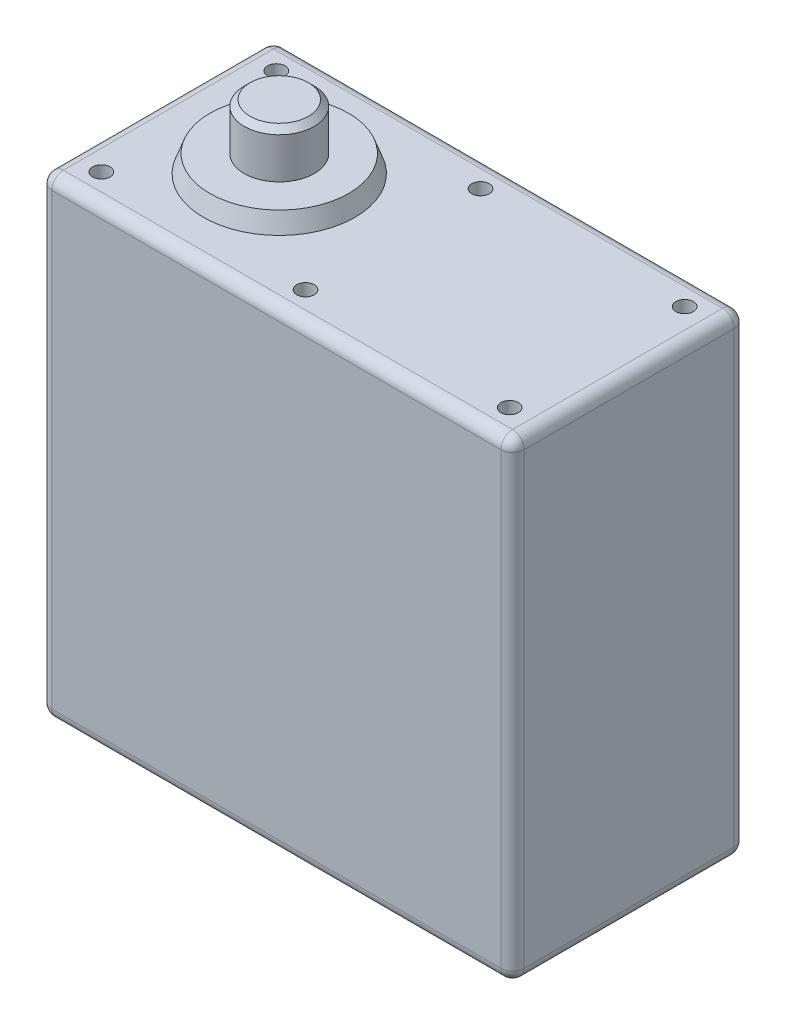
ISO-10303-21;
HEADER;
FILE_DESCRIPTION(('STEP AP214'),'2;1');
FILE_NAME('part.step','',(''),(''),'','','');
FILE_SCHEMA(('AUTOMOTIVE_DESIGN { 1 0 10303 214 1 1 1 1 }'));
ENDSEC;
DATA;
#1=APPLICATION_CONTEXT('core data for automotive mechanical design processes');
#2=APPLICATION_PROTOCOL_DEFINITION('international standard','automotive_design',2000,#1);
#3=PRODUCT_CONTEXT('',#1,'mechanical');
#4=PRODUCT('Part','Part','',(#3));
#5=PRODUCT_RELATED_PRODUCT_CATEGORY('part','',(#4));
#6=PRODUCT_DEFINITION_FORMATION('','',#4);
#7=PRODUCT_DEFINITION_CONTEXT('part definition',#1,'design');
#8=PRODUCT_DEFINITION('design','',#6,#7);
#9=PRODUCT_DEFINITION_SHAPE('','',#8);
#10=(LENGTH_UNIT() NAMED_UNIT(*) SI_UNIT(.MILLI.,.METRE.));
#11=(NAMED_UNIT(*) PLANE_ANGLE_UNIT() SI_UNIT($,.RADIAN.));
#12=(NAMED_UNIT(*) SI_UNIT($,.STERADIAN.) SOLID_ANGLE_UNIT());
#13=UNCERTAINTY_MEASURE_WITH_UNIT(LENGTH_MEASURE(1.E-05),#10,'distance_accuracy_value','');
#14=(GEOMETRIC_REPRESENTATION_CONTEXT(3) GLOBAL_UNCERTAINTY_ASSIGNED_CONTEXT((#13)) GLOBAL_UNIT_ASSIGNED_CONTEXT((#10,
#11,#12)) REPRESENTATION_CONTEXT('',''));
#15=CARTESIAN_POINT('',(0.,0.,0.));
#16=DIRECTION('',(0.,0.,1.));
#17=DIRECTION('',(1.,0.,0.));
#18=AXIS2_PLACEMENT_3D('',#15,#16,#17);
#19=CARTESIAN_POINT('',(-20.25,-20.25,20.));
#20=DIRECTION('',(0.,1.,0.));
#21=DIRECTION('',(0.,0.,1.));
#22=AXIS2_PLACEMENT_3D('',#19,#20,#21);
#23=PLANE('',#22);
#24=DIRECTION('',(0.,0.,-1.));
#25=VECTOR('',#24,1.);
#26=CARTESIAN_POINT('',(19.25,-20.25,20.));
#27=LINE('',#26,#25);
#28=CARTESIAN_POINT('',(19.25,-20.25,1.));
#29=VERTEX_POINT('',#28);
#30=CARTESIAN_POINT('',(19.25,-20.25,19.));
#31=VERTEX_POINT('',#30);
#32=EDGE_CURVE('E305',#29,#31,#27,.F.);
#33=ORIENTED_EDGE('',*,*,#32,.T.);
#34=DIRECTION('',(1.,0.,0.));
#35=VECTOR('',#34,1.);
#36=CARTESIAN_POINT('',(-19.25,-20.25,19.));
#37=LINE('',#36,#35);
#38=CARTESIAN_POINT('',(-19.25,-20.25,19.));
#39=VERTEX_POINT('',#38);
#40=EDGE_CURVE('E311',#31,#39,#37,.F.);
#41=ORIENTED_EDGE('',*,*,#40,.T.);
#42=DIRECTION('',(0.,0.,-1.));
#43=VECTOR('',#42,1.);
#44=CARTESIAN_POINT('',(-19.25,-20.25,20.));
#45=LINE('',#44,#43);
#46=CARTESIAN_POINT('',(-19.25,-20.25,1.));
#47=VERTEX_POINT('',#46);
#48=EDGE_CURVE('E309',#39,#47,#45,.T.);
#49=ORIENTED_EDGE('',*,*,#48,.T.);
#50=DIRECTION('',(1.,0.,0.));
#51=VECTOR('',#50,1.);
#52=CARTESIAN_POINT('',(-20.25,-20.25,1.));
#53=LINE('',#52,#51);
#54=EDGE_CURVE('E307',#47,#29,#53,.T.);
#55=ORIENTED_EDGE('',*,*,#54,.T.);
#56=EDGE_LOOP('',(#33,#41,#49,#55));
#57=FACE_BOUND('',#56,.T.);
#58=CARTESIAN_POINT('',(-17.5,-20.25,17.5));
#59=DIRECTION('',(0.,1.,0.));
#60=DIRECTION('',(0.,0.,-1.));
#61=AXIS2_PLACEMENT_3D('',#58,#59,#60);
#62=CIRCLE('',#61,0.750000000000002);
#63=CARTESIAN_POINT('',(-17.5,-20.25,16.75));
#64=VERTEX_POINT('',#63);
#65=EDGE_CURVE('E234',#64,#64,#62,.T.);
#66=ORIENTED_EDGE('',*,*,#65,.T.);
#67=EDGE_LOOP('',(#66));
#68=FACE_BOUND('',#67,.T.);
#69=CARTESIAN_POINT('',(0.,-20.25,17.5));
#70=DIRECTION('',(0.,1.,0.));
#71=DIRECTION('',(0.,0.,-1.));
#72=AXIS2_PLACEMENT_3D('',#69,#70,#71);
#73=CIRCLE('',#72,0.749999999999999);
#74=CARTESIAN_POINT('',(0.,-20.25,16.75));
#75=VERTEX_POINT('',#74);
#76=EDGE_CURVE('E240',#75,#75,#73,.T.);
#77=ORIENTED_EDGE('',*,*,#76,.T.);
#78=EDGE_LOOP('',(#77));
#79=FACE_BOUND('',#78,.T.);
#80=CARTESIAN_POINT('',(17.5,-20.25,17.5));
#81=DIRECTION('',(0.,1.,0.));
#82=DIRECTION('',(0.,0.,-1.));
#83=AXIS2_PLACEMENT_3D('',#80,#81,#82);
#84=CIRCLE('',#83,0.750000000000002);
#85=CARTESIAN_POINT('',(17.5,-20.25,16.75));
#86=VERTEX_POINT('',#85);
#87=EDGE_CURVE('E246',#86,#86,#84,.T.);
#88=ORIENTED_EDGE('',*,*,#87,.T.);
#89=EDGE_LOOP('',(#88));
#90=FACE_BOUND('',#89,.T.);
#91=CARTESIAN_POINT('',(17.5,-20.25,2.5));
#92=DIRECTION('',(0.,1.,0.));
#93=DIRECTION('',(0.,0.,1.));
#94=AXIS2_PLACEMENT_3D('',#91,#92,#93);
#95=CIRCLE('',#94,0.750000000000002);
#96=CARTESIAN_POINT('',(17.5,-20.25,3.25));
#97=VERTEX_POINT('',#96);
#98=EDGE_CURVE('E252',#97,#97,#95,.T.);
#99=ORIENTED_EDGE('',*,*,#98,.T.);
#100=EDGE_LOOP('',(#99));
#101=FACE_BOUND('',#100,.T.);
#102=CARTESIAN_POINT('',(0.,-20.25,2.5));
#103=DIRECTION('',(0.,1.,0.));
#104=DIRECTION('',(0.,0.,1.));
#105=AXIS2_PLACEMENT_3D('',#102,#103,#104);
#106=CIRCLE('',#105,0.75);
#107=CARTESIAN_POINT('',(0.,-20.25,3.25));
#108=VERTEX_POINT('',#107);
#109=EDGE_CURVE('E258',#108,#108,#106,.T.);
#110=ORIENTED_EDGE('',*,*,#109,.T.);
#111=EDGE_LOOP('',(#110));
#112=FACE_BOUND('',#111,.T.);
#113=CARTESIAN_POINT('',(-17.5,-20.25,2.50000000000001));
#114=DIRECTION('',(0.,1.,0.));
#115=DIRECTION('',(0.,0.,1.));
#116=AXIS2_PLACEMENT_3D('',#113,#114,#115);
#117=CIRCLE('',#116,0.750000000000002);
#118=CARTESIAN_POINT('',(-17.5,-20.25,3.25000000000001));
#119=VERTEX_POINT('',#118);
#120=EDGE_CURVE('E264',#119,#119,#117,.T.);
#121=ORIENTED_EDGE('',*,*,#120,.T.);
#122=EDGE_LOOP('',(#121));
#123=FACE_BOUND('',#122,.T.);
#124=CARTESIAN_POINT('',(-9.75,-20.25,10.));
#125=DIRECTION('',(0.,1.,0.));
#126=DIRECTION('',(0.,0.,1.));
#127=AXIS2_PLACEMENT_3D('',#124,#125,#126);
#128=CIRCLE('',#127,3.);
#129=CARTESIAN_POINT('',(-9.75,-20.25,13.));
#130=VERTEX_POINT('',#129);
#131=EDGE_CURVE('E281',#130,#130,#128,.F.);
#132=ORIENTED_EDGE('',*,*,#131,.F.);
#133=EDGE_LOOP('',(#132));
#134=FACE_BOUND('',#133,.T.);
#135=ADVANCED_FACE('F38',(#57,#68,#79,#90,#101,#112,#123,#134),#23,.F.);
#136=CARTESIAN_POINT('',(-9.75,21.75,10.));
#137=DIRECTION('',(0.,1.,0.));
#138=DIRECTION('',(0.,0.,1.));
#139=AXIS2_PLACEMENT_3D('',#136,#137,#138);
#140=PLANE('',#139);
#141=CARTESIAN_POINT('',(-9.75,21.75,10.));
#142=DIRECTION('',(0.,1.,0.));
#143=DIRECTION('',(0.,0.,1.));
#144=AXIS2_PLACEMENT_3D('',#141,#142,#143);
#145=CIRCLE('',#144,5.95404464860072);
#146=CARTESIAN_POINT('',(-9.75,21.75,15.9540446486007));
#147=VERTEX_POINT('',#146);
#148=EDGE_CURVE('E272',#147,#147,#145,.T.);
#149=ORIENTED_EDGE('',*,*,#148,.T.);
#150=EDGE_LOOP('',(#149));
#151=FACE_BOUND('',#150,.T.);
#152=CARTESIAN_POINT('',(-9.75,21.75,10.));
#153=DIRECTION('',(0.,1.,0.));
#154=DIRECTION('',(0.,0.,1.));
#155=AXIS2_PLACEMENT_3D('',#152,#153,#154);
#156=CIRCLE('',#155,3.);
#157=CARTESIAN_POINT('',(-9.75,21.75,13.));
#158=VERTEX_POINT('',#157);
#159=EDGE_CURVE('E230',#158,#158,#156,.T.);
#160=ORIENTED_EDGE('',*,*,#159,.F.);
#161=EDGE_LOOP('',(#160));
#162=FACE_BOUND('',#161,.T.);
#163=ADVANCED_FACE('F382',(#151,#162),#140,.T.);
#164=CARTESIAN_POINT('',(-20.25,20.25,20.));
#165=DIRECTION('',(0.,-1.,0.));
#166=DIRECTION('',(0.,0.,-1.));
#167=AXIS2_PLACEMENT_3D('',#164,#165,#166);
#168=PLANE('',#167);
#169=DIRECTION('',(0.,0.,-1.));
#170=VECTOR('',#169,1.);
#171=CARTESIAN_POINT('',(-19.25,20.25,20.));
#172=LINE('',#171,#170);
#173=CARTESIAN_POINT('',(-19.25,20.25,1.));
#174=VERTEX_POINT('',#173);
#175=CARTESIAN_POINT('',(-19.25,20.25,19.));
#176=VERTEX_POINT('',#175);
#177=EDGE_CURVE('E47',#174,#176,#172,.F.);
#178=ORIENTED_EDGE('',*,*,#177,.T.);
#179=DIRECTION('',(-1.,0.,0.));
#180=VECTOR('',#179,1.);
#181=CARTESIAN_POINT('',(19.25,20.25,19.));
#182=LINE('',#181,#180);
#183=CARTESIAN_POINT('',(19.25,20.25,19.));
#184=VERTEX_POINT('',#183);
#185=EDGE_CURVE('E11',#176,#184,#182,.F.);
#186=ORIENTED_EDGE('',*,*,#185,.T.);
#187=DIRECTION('',(0.,0.,-1.));
#188=VECTOR('',#187,1.);
#189=CARTESIAN_POINT('',(19.25,20.25,20.));
#190=LINE('',#189,#188);
#191=CARTESIAN_POINT('',(19.25,20.25,1.));
#192=VERTEX_POINT('',#191);
#193=EDGE_CURVE('E163',#184,#192,#190,.T.);
#194=ORIENTED_EDGE('',*,*,#193,.T.);
#195=DIRECTION('',(-1.,0.,0.));
#196=VECTOR('',#195,1.);
#197=CARTESIAN_POINT('',(-20.25,20.25,1.));
#198=LINE('',#197,#196);
#199=EDGE_CURVE('E58',#192,#174,#198,.T.);
#200=ORIENTED_EDGE('',*,*,#199,.T.);
#201=EDGE_LOOP('',(#178,#186,#194,#200));
#202=FACE_BOUND('',#201,.T.);
#203=CARTESIAN_POINT('',(-17.5,20.25,17.5));
#204=DIRECTION('',(0.,1.,0.));
#205=DIRECTION('',(0.,0.,-1.));
#206=AXIS2_PLACEMENT_3D('',#203,#204,#205);
#207=CIRCLE('',#206,0.750000000000002);
#208=CARTESIAN_POINT('',(-17.5,20.25,16.75));
#209=VERTEX_POINT('',#208);
#210=EDGE_CURVE('E233',#209,#209,#207,.T.);
#211=ORIENTED_EDGE('',*,*,#210,.F.);
#212=EDGE_LOOP('',(#211));
#213=FACE_BOUND('',#212,.T.);
#214=CARTESIAN_POINT('',(0.,20.25,17.5));
#215=DIRECTION('',(0.,1.,0.));
#216=DIRECTION('',(0.,0.,-1.));
#217=AXIS2_PLACEMENT_3D('',#214,#215,#216);
#218=CIRCLE('',#217,0.749999999999999);
#219=CARTESIAN_POINT('',(0.,20.25,16.75));
#220=VERTEX_POINT('',#219);
#221=EDGE_CURVE('E237',#220,#220,#218,.T.);
#222=ORIENTED_EDGE('',*,*,#221,.F.);
#223=EDGE_LOOP('',(#222));
#224=FACE_BOUND('',#223,.T.);
#225=CARTESIAN_POINT('',(17.5,20.25,17.5));
#226=DIRECTION('',(0.,1.,0.));
#227=DIRECTION('',(0.,0.,-1.));
#228=AXIS2_PLACEMENT_3D('',#225,#226,#227);
#229=CIRCLE('',#228,0.750000000000002);
#230=CARTESIAN_POINT('',(17.5,20.25,16.75));
#231=VERTEX_POINT('',#230);
#232=EDGE_CURVE('E243',#231,#231,#229,.T.);
#233=ORIENTED_EDGE('',*,*,#232,.F.);
#234=EDGE_LOOP('',(#233));
#235=FACE_BOUND('',#234,.T.);
#236=CARTESIAN_POINT('',(17.5,20.25,2.5));
#237=DIRECTION('',(0.,1.,0.));
#238=DIRECTION('',(0.,0.,1.));
#239=AXIS2_PLACEMENT_3D('',#236,#237,#238);
#240=CIRCLE('',#239,0.750000000000002);
#241=CARTESIAN_POINT('',(17.5,20.25,3.25));
#242=VERTEX_POINT('',#241);
#243=EDGE_CURVE('E249',#242,#242,#240,.T.);
#244=ORIENTED_EDGE('',*,*,#243,.F.);
#245=EDGE_LOOP('',(#244));
#246=FACE_BOUND('',#245,.T.);
#247=CARTESIAN_POINT('',(0.,20.25,2.5));
#248=DIRECTION('',(0.,1.,0.));
#249=DIRECTION('',(0.,0.,1.));
#250=AXIS2_PLACEMENT_3D('',#247,#248,#249);
#251=CIRCLE('',#250,0.75);
#252=CARTESIAN_POINT('',(0.,20.25,3.25));
#253=VERTEX_POINT('',#252);
#254=EDGE_CURVE('E255',#253,#253,#251,.T.);
#255=ORIENTED_EDGE('',*,*,#254,.F.);
#256=EDGE_LOOP('',(#255));
#257=FACE_BOUND('',#256,.T.);
#258=CARTESIAN_POINT('',(-17.5,20.25,2.50000000000001));
#259=DIRECTION('',(0.,1.,0.));
#260=DIRECTION('',(0.,0.,1.));
#261=AXIS2_PLACEMENT_3D('',#258,#259,#260);
#262=CIRCLE('',#261,0.750000000000002);
#263=CARTESIAN_POINT('',(-17.5,20.25,3.25000000000001));
#264=VERTEX_POINT('',#263);
#265=EDGE_CURVE('E261',#264,#264,#262,.T.);
#266=ORIENTED_EDGE('',*,*,#265,.F.);
#267=EDGE_LOOP('',(#266));
#268=FACE_BOUND('',#267,.T.);
#269=CARTESIAN_POINT('',(-9.75,20.25,10.));
#270=DIRECTION('',(0.,-1.,0.));
#271=DIRECTION('',(0.,0.,-1.));
#272=AXIS2_PLACEMENT_3D('',#269,#270,#271);
#273=CIRCLE('',#272,6.5);
#274=CARTESIAN_POINT('',(-9.75,20.25,3.5));
#275=VERTEX_POINT('',#274);
#276=EDGE_CURVE('E267',#275,#275,#273,.F.);
#277=ORIENTED_EDGE('',*,*,#276,.F.);
#278=EDGE_LOOP('',(#277));
#279=FACE_BOUND('',#278,.T.);
#280=ADVANCED_FACE('F335',(#202,#213,#224,#235,#246,#257,#268,#279),#168,.F.);
#281=CARTESIAN_POINT('',(-20.25,20.25,20.));
#282=DIRECTION('',(1.,0.,0.));
#283=DIRECTION('',(0.,1.,0.));
#284=AXIS2_PLACEMENT_3D('',#281,#282,#283);
#285=PLANE('',#284);
#286=DIRECTION('',(0.,-1.,0.));
#287=VECTOR('',#286,1.);
#288=CARTESIAN_POINT('',(-20.25,20.25,1.));
#289=LINE('',#288,#287);
#290=CARTESIAN_POINT('',(-20.25,19.25,1.));
#291=VERTEX_POINT('',#290);
#292=CARTESIAN_POINT('',(-20.25,-19.25,1.));
#293=VERTEX_POINT('',#292);
#294=EDGE_CURVE('E159',#291,#293,#289,.T.);
#295=ORIENTED_EDGE('',*,*,#294,.T.);
#296=DIRECTION('',(0.,0.,-1.));
#297=VECTOR('',#296,1.);
#298=CARTESIAN_POINT('',(-20.25,-19.25,20.));
#299=LINE('',#298,#297);
#300=CARTESIAN_POINT('',(-20.25,-19.25,19.));
#301=VERTEX_POINT('',#300);
#302=EDGE_CURVE('E320',#293,#301,#299,.F.);
#303=ORIENTED_EDGE('',*,*,#302,.T.);
#304=DIRECTION('',(0.,-1.,0.));
#305=VECTOR('',#304,1.);
#306=CARTESIAN_POINT('',(-20.25,20.25,19.));
#307=LINE('',#306,#305);
#308=CARTESIAN_POINT('',(-20.25,19.25,19.));
#309=VERTEX_POINT('',#308);
#310=EDGE_CURVE('E295',#301,#309,#307,.F.);
#311=ORIENTED_EDGE('',*,*,#310,.T.);
#312=DIRECTION('',(0.,0.,-1.));
#313=VECTOR('',#312,1.);
#314=CARTESIAN_POINT('',(-20.25,19.25,20.));
#315=LINE('',#314,#313);
#316=EDGE_CURVE('E318',#309,#291,#315,.T.);
#317=ORIENTED_EDGE('',*,*,#316,.T.);
#318=EDGE_LOOP('',(#295,#303,#311,#317));
#319=FACE_BOUND('',#318,.T.);
#320=ADVANCED_FACE('F454',(#319),#285,.F.);
#321=CARTESIAN_POINT('',(20.25,20.25,20.));
#322=DIRECTION('',(-1.,0.,0.));
#323=DIRECTION('',(0.,-1.,0.));
#324=AXIS2_PLACEMENT_3D('',#321,#322,#323);
#325=PLANE('',#324);
#326=DIRECTION('',(0.,1.,0.));
#327=VECTOR('',#326,1.);
#328=CARTESIAN_POINT('',(20.25,-20.25,19.));
#329=LINE('',#328,#327);
#330=CARTESIAN_POINT('',(20.25,19.25,19.));
#331=VERTEX_POINT('',#330);
#332=CARTESIAN_POINT('',(20.25,-19.25,19.));
#333=VERTEX_POINT('',#332);
#334=EDGE_CURVE('E131',#331,#333,#329,.F.);
#335=ORIENTED_EDGE('',*,*,#334,.T.);
#336=DIRECTION('',(0.,0.,-1.));
#337=VECTOR('',#336,1.);
#338=CARTESIAN_POINT('',(20.25,-19.25,20.));
#339=LINE('',#338,#337);
#340=CARTESIAN_POINT('',(20.25,-19.25,1.));
#341=VERTEX_POINT('',#340);
#342=EDGE_CURVE('E138',#333,#341,#339,.T.);
#343=ORIENTED_EDGE('',*,*,#342,.T.);
#344=DIRECTION('',(0.,1.,0.));
#345=VECTOR('',#344,1.);
#346=CARTESIAN_POINT('',(20.25,20.25,1.));
#347=LINE('',#346,#345);
#348=CARTESIAN_POINT('',(20.25,19.25,1.));
#349=VERTEX_POINT('',#348);
#350=EDGE_CURVE('E133',#341,#349,#347,.T.);
#351=ORIENTED_EDGE('',*,*,#350,.T.);
#352=DIRECTION('',(0.,0.,-1.));
#353=VECTOR('',#352,1.);
#354=CARTESIAN_POINT('',(20.25,19.25,20.));
#355=LINE('',#354,#353);
#356=EDGE_CURVE('E128',#349,#331,#355,.F.);
#357=ORIENTED_EDGE('',*,*,#356,.T.);
#358=EDGE_LOOP('',(#335,#343,#351,#357));
#359=FACE_BOUND('',#358,.T.);
#360=ADVANCED_FACE('F130',(#359),#325,.F.);
#361=CARTESIAN_POINT('',(-20.25,-20.25,20.));
#362=DIRECTION('',(0.,0.,1.));
#363=DIRECTION('',(1.,0.,0.));
#364=AXIS2_PLACEMENT_3D('',#361,#362,#363);
#365=PLANE('',#364);
#366=DIRECTION('',(0.,-1.,0.));
#367=VECTOR('',#366,1.);
#368=CARTESIAN_POINT('',(-19.25,-20.25,20.));
#369=LINE('',#368,#367);
#370=CARTESIAN_POINT('',(-19.25,19.25,20.));
#371=VERTEX_POINT('',#370);
#372=CARTESIAN_POINT('',(-19.25,-19.25,20.));
#373=VERTEX_POINT('',#372);
#374=EDGE_CURVE('E284',#371,#373,#369,.T.);
#375=ORIENTED_EDGE('',*,*,#374,.T.);
#376=DIRECTION('',(1.,0.,0.));
#377=VECTOR('',#376,1.);
#378=CARTESIAN_POINT('',(19.25,-19.25,20.));
#379=LINE('',#378,#377);
#380=CARTESIAN_POINT('',(19.25,-19.25,20.));
#381=VERTEX_POINT('',#380);
#382=EDGE_CURVE('E303',#373,#381,#379,.T.);
#383=ORIENTED_EDGE('',*,*,#382,.T.);
#384=DIRECTION('',(0.,1.,0.));
#385=VECTOR('',#384,1.);
#386=CARTESIAN_POINT('',(19.25,20.25,20.));
#387=LINE('',#386,#385);
#388=CARTESIAN_POINT('',(19.25,19.25,20.));
#389=VERTEX_POINT('',#388);
#390=EDGE_CURVE('E287',#381,#389,#387,.T.);
#391=ORIENTED_EDGE('',*,*,#390,.T.);
#392=DIRECTION('',(-1.,0.,0.));
#393=VECTOR('',#392,1.);
#394=CARTESIAN_POINT('',(-19.25,19.25,20.));
#395=LINE('',#394,#393);
#396=EDGE_CURVE('E301',#389,#371,#395,.T.);
#397=ORIENTED_EDGE('',*,*,#396,.T.);
#398=EDGE_LOOP('',(#375,#383,#391,#397));
#399=FACE_BOUND('',#398,.T.);
#400=ADVANCED_FACE('F447',(#399),#365,.T.);
#401=CARTESIAN_POINT('',(-20.25,-20.25,0.));
#402=DIRECTION('',(0.,0.,1.));
#403=DIRECTION('',(1.,0.,0.));
#404=AXIS2_PLACEMENT_3D('',#401,#402,#403);
#405=PLANE('',#404);
#406=DIRECTION('',(0.,1.,0.));
#407=VECTOR('',#406,1.);
#408=CARTESIAN_POINT('',(19.25,-20.25,0.));
#409=LINE('',#408,#407);
#410=CARTESIAN_POINT('',(19.25,19.25,0.));
#411=VERTEX_POINT('',#410);
#412=CARTESIAN_POINT('',(19.25,-19.25,0.));
#413=VERTEX_POINT('',#412);
#414=EDGE_CURVE('E292',#411,#413,#409,.F.);
#415=ORIENTED_EDGE('',*,*,#414,.T.);
#416=DIRECTION('',(1.,0.,0.));
#417=VECTOR('',#416,1.);
#418=CARTESIAN_POINT('',(-20.25,-19.25,0.));
#419=LINE('',#418,#417);
#420=CARTESIAN_POINT('',(-19.25,-19.25,0.));
#421=VERTEX_POINT('',#420);
#422=EDGE_CURVE('E328',#413,#421,#419,.F.);
#423=ORIENTED_EDGE('',*,*,#422,.T.);
#424=DIRECTION('',(0.,-1.,0.));
#425=VECTOR('',#424,1.);
#426=CARTESIAN_POINT('',(-19.25,-20.25,0.));
#427=LINE('',#426,#425);
#428=CARTESIAN_POINT('',(-19.25,19.25,0.));
#429=VERTEX_POINT('',#428);
#430=EDGE_CURVE('E151',#421,#429,#427,.F.);
#431=ORIENTED_EDGE('',*,*,#430,.T.);
#432=DIRECTION('',(-1.,0.,0.));
#433=VECTOR('',#432,1.);
#434=CARTESIAN_POINT('',(-20.25,19.25,0.));
#435=LINE('',#434,#433);
#436=EDGE_CURVE('E326',#429,#411,#435,.F.);
#437=ORIENTED_EDGE('',*,*,#436,.T.);
#438=EDGE_LOOP('',(#415,#423,#431,#437));
#439=FACE_BOUND('',#438,.T.);
#440=ADVANCED_FACE('F348',(#439),#405,.F.);
#441=CARTESIAN_POINT('',(-17.5,-20.25,2.50000000000001));
#442=DIRECTION('',(0.,1.,0.));
#443=DIRECTION('',(0.,0.,1.));
#444=AXIS2_PLACEMENT_3D('',#441,#442,#443);
#445=CYLINDRICAL_SURFACE('',#444,0.750000000000002);
#446=ORIENTED_EDGE('',*,*,#120,.F.);
#447=EDGE_LOOP('',(#446));
#448=FACE_BOUND('',#447,.T.);
#449=ORIENTED_EDGE('',*,*,#265,.T.);
#450=EDGE_LOOP('',(#449));
#451=FACE_BOUND('',#450,.T.);
#452=ADVANCED_FACE('F442',(#448,#451),#445,.F.);
#453=CARTESIAN_POINT('',(0.,-20.25,2.5));
#454=DIRECTION('',(0.,1.,0.));
#455=DIRECTION('',(0.,0.,1.));
#456=AXIS2_PLACEMENT_3D('',#453,#454,#455);
#457=CYLINDRICAL_SURFACE('',#456,0.75);
#458=ORIENTED_EDGE('',*,*,#109,.F.);
#459=EDGE_LOOP('',(#458));
#460=FACE_BOUND('',#459,.T.);
#461=ORIENTED_EDGE('',*,*,#254,.T.);
#462=EDGE_LOOP('',(#461));
#463=FACE_BOUND('',#462,.T.);
#464=ADVANCED_FACE('F438',(#460,#463),#457,.F.);
#465=CARTESIAN_POINT('',(17.5,-20.25,2.5));
#466=DIRECTION('',(0.,1.,0.));
#467=DIRECTION('',(0.,0.,1.));
#468=AXIS2_PLACEMENT_3D('',#465,#466,#467);
#469=CYLINDRICAL_SURFACE('',#468,0.750000000000002);
#470=ORIENTED_EDGE('',*,*,#98,.F.);
#471=EDGE_LOOP('',(#470));
#472=FACE_BOUND('',#471,.T.);
#473=ORIENTED_EDGE('',*,*,#243,.T.);
#474=EDGE_LOOP('',(#473));
#475=FACE_BOUND('',#474,.T.);
#476=ADVANCED_FACE('F434',(#472,#475),#469,.F.);
#477=CARTESIAN_POINT('',(17.5,-20.25,17.5));
#478=DIRECTION('',(0.,1.,0.));
#479=DIRECTION('',(0.,0.,1.));
#480=AXIS2_PLACEMENT_3D('',#477,#478,#479);
#481=CYLINDRICAL_SURFACE('',#480,0.750000000000002);
#482=ORIENTED_EDGE('',*,*,#87,.F.);
#483=EDGE_LOOP('',(#482));
#484=FACE_BOUND('',#483,.T.);
#485=ORIENTED_EDGE('',*,*,#232,.T.);
#486=EDGE_LOOP('',(#485));
#487=FACE_BOUND('',#486,.T.);
#488=ADVANCED_FACE('F430',(#484,#487),#481,.F.);
#489=CARTESIAN_POINT('',(0.,-20.25,17.5));
#490=DIRECTION('',(0.,1.,0.));
#491=DIRECTION('',(0.,0.,1.));
#492=AXIS2_PLACEMENT_3D('',#489,#490,#491);
#493=CYLINDRICAL_SURFACE('',#492,0.749999999999999);
#494=ORIENTED_EDGE('',*,*,#76,.F.);
#495=EDGE_LOOP('',(#494));
#496=FACE_BOUND('',#495,.T.);
#497=ORIENTED_EDGE('',*,*,#221,.T.);
#498=EDGE_LOOP('',(#497));
#499=FACE_BOUND('',#498,.T.);
#500=ADVANCED_FACE('F426',(#496,#499),#493,.F.);
#501=CARTESIAN_POINT('',(-17.5,-20.25,17.5));
#502=DIRECTION('',(0.,1.,0.));
#503=DIRECTION('',(0.,0.,1.));
#504=AXIS2_PLACEMENT_3D('',#501,#502,#503);
#505=CYLINDRICAL_SURFACE('',#504,0.750000000000002);
#506=ORIENTED_EDGE('',*,*,#65,.F.);
#507=EDGE_LOOP('',(#506));
#508=FACE_BOUND('',#507,.T.);
#509=ORIENTED_EDGE('',*,*,#210,.T.);
#510=EDGE_LOOP('',(#509));
#511=FACE_BOUND('',#510,.T.);
#512=ADVANCED_FACE('F422',(#508,#511),#505,.F.);
#513=CARTESIAN_POINT('',(-9.75,25.75,10.));
#514=DIRECTION('',(0.,-1.,0.));
#515=DIRECTION('',(0.,0.,-1.));
#516=AXIS2_PLACEMENT_3D('',#513,#514,#515);
#517=CYLINDRICAL_SURFACE('',#516,3.);
#518=CARTESIAN_POINT('',(-9.75,25.25,10.));
#519=DIRECTION('',(0.,1.,0.));
#520=DIRECTION('',(0.,0.,1.));
#521=AXIS2_PLACEMENT_3D('',#518,#519,#520);
#522=CIRCLE('',#521,3.);
#523=CARTESIAN_POINT('',(-9.75,25.25,13.));
#524=VERTEX_POINT('',#523);
#525=EDGE_CURVE('E278',#524,#524,#522,.F.);
#526=ORIENTED_EDGE('',*,*,#525,.T.);
#527=EDGE_LOOP('',(#526));
#528=FACE_BOUND('',#527,.T.);
#529=ORIENTED_EDGE('',*,*,#159,.T.);
#530=EDGE_LOOP('',(#529));
#531=FACE_BOUND('',#530,.T.);
#532=ADVANCED_FACE('F418',(#528,#531),#517,.T.);
#533=CARTESIAN_POINT('',(-9.75,25.75,10.));
#534=DIRECTION('',(0.,1.,0.));
#535=DIRECTION('',(0.,0.,1.));
#536=AXIS2_PLACEMENT_3D('',#533,#534,#535);
#537=PLANE('',#536);
#538=CARTESIAN_POINT('',(-9.75,25.75,10.));
#539=DIRECTION('',(0.,1.,0.));
#540=DIRECTION('',(0.,0.,1.));
#541=AXIS2_PLACEMENT_3D('',#538,#539,#540);
#542=CIRCLE('',#541,2.5);
#543=CARTESIAN_POINT('',(-9.75,25.75,12.5));
#544=VERTEX_POINT('',#543);
#545=EDGE_CURVE('E275',#544,#544,#542,.T.);
#546=ORIENTED_EDGE('',*,*,#545,.T.);
#547=EDGE_LOOP('',(#546));
#548=FACE_BOUND('',#547,.T.);
#549=ADVANCED_FACE('F414',(#548),#537,.T.);
#550=CARTESIAN_POINT('',(-9.75,21.75,10.));
#551=DIRECTION('',(0.,-1.,0.));
#552=DIRECTION('',(0.,0.,-1.));
#553=AXIS2_PLACEMENT_3D('',#550,#551,#552);
#554=CONICAL_SURFACE('',#553,5.95404464860072,0.349065850398864);
#555=ORIENTED_EDGE('',*,*,#276,.T.);
#556=EDGE_LOOP('',(#555));
#557=FACE_BOUND('',#556,.T.);
#558=ORIENTED_EDGE('',*,*,#148,.F.);
#559=EDGE_LOOP('',(#558));
#560=FACE_BOUND('',#559,.T.);
#561=ADVANCED_FACE('F417',(#557,#560),#554,.T.);
#562=CARTESIAN_POINT('',(-9.75,25.75,10.));
#563=DIRECTION('',(0.,-1.,0.));
#564=DIRECTION('',(0.,0.,-1.));
#565=AXIS2_PLACEMENT_3D('',#562,#563,#564);
#566=CONICAL_SURFACE('',#565,2.5,0.785398163397448);
#567=ORIENTED_EDGE('',*,*,#525,.F.);
#568=EDGE_LOOP('',(#567));
#569=FACE_BOUND('',#568,.T.);
#570=ORIENTED_EDGE('',*,*,#545,.F.);
#571=EDGE_LOOP('',(#570));
#572=FACE_BOUND('',#571,.T.);
#573=ADVANCED_FACE('F411',(#569,#572),#566,.T.);
#574=CARTESIAN_POINT('',(-9.75,-21.75,10.));
#575=DIRECTION('',(0.,-1.,0.));
#576=DIRECTION('',(0.,0.,-1.));
#577=AXIS2_PLACEMENT_3D('',#574,#575,#576);
#578=PLANE('',#577);
#579=CARTESIAN_POINT('',(-9.75,-21.75,10.));
#580=DIRECTION('',(0.,-1.,0.));
#581=DIRECTION('',(0.,0.,-1.));
#582=AXIS2_PLACEMENT_3D('',#579,#580,#581);
#583=CIRCLE('',#582,3.);
#584=CARTESIAN_POINT('',(-9.75,-21.75,7.));
#585=VERTEX_POINT('',#584);
#586=EDGE_CURVE('E225',#585,#585,#583,.T.);
#587=ORIENTED_EDGE('',*,*,#586,.T.);
#588=EDGE_LOOP('',(#587));
#589=FACE_BOUND('',#588,.T.);
#590=CARTESIAN_POINT('',(-9.75,-21.75,10.));
#591=DIRECTION('',(0.,-1.,0.));
#592=DIRECTION('',(0.,0.,-1.));
#593=AXIS2_PLACEMENT_3D('',#590,#591,#592);
#594=CIRCLE('',#593,1.25);
#595=CARTESIAN_POINT('',(-9.75,-21.75,8.75));
#596=VERTEX_POINT('',#595);
#597=EDGE_CURVE('E220',#596,#596,#594,.T.);
#598=ORIENTED_EDGE('',*,*,#597,.F.);
#599=EDGE_LOOP('',(#598));
#600=FACE_BOUND('',#599,.T.);
#601=ADVANCED_FACE('F405',(#589,#600),#578,.T.);
#602=CARTESIAN_POINT('',(-9.75,-21.75,10.));
#603=DIRECTION('',(0.,1.,0.));
#604=DIRECTION('',(0.,0.,1.));
#605=AXIS2_PLACEMENT_3D('',#602,#603,#604);
#606=CYLINDRICAL_SURFACE('',#605,3.);
#607=ORIENTED_EDGE('',*,*,#586,.F.);
#608=EDGE_LOOP('',(#607));
#609=FACE_BOUND('',#608,.T.);
#610=ORIENTED_EDGE('',*,*,#131,.T.);
#611=EDGE_LOOP('',(#610));
#612=FACE_BOUND('',#611,.T.);
#613=ADVANCED_FACE('F399',(#609,#612),#606,.T.);
#614=CARTESIAN_POINT('',(-9.75,-21.75,10.));
#615=DIRECTION('',(0.,1.,0.));
#616=DIRECTION('',(0.,0.,1.));
#617=AXIS2_PLACEMENT_3D('',#614,#615,#616);
#618=CYLINDRICAL_SURFACE('',#617,1.25);
#619=ORIENTED_EDGE('',*,*,#597,.T.);
#620=EDGE_LOOP('',(#619));
#621=FACE_BOUND('',#620,.T.);
#622=CARTESIAN_POINT('',(-9.75,-20.25,10.));
#623=DIRECTION('',(0.,-1.,0.));
#624=DIRECTION('',(0.,0.,-1.));
#625=AXIS2_PLACEMENT_3D('',#622,#623,#624);
#626=CIRCLE('',#625,1.25);
#627=CARTESIAN_POINT('',(-9.75,-20.25,8.75));
#628=VERTEX_POINT('',#627);
#629=EDGE_CURVE('E215',#628,#628,#626,.T.);
#630=ORIENTED_EDGE('',*,*,#629,.F.);
#631=EDGE_LOOP('',(#630));
#632=FACE_BOUND('',#631,.T.);
#633=ADVANCED_FACE('F393',(#621,#632),#618,.F.);
#634=ORIENTED_EDGE('',*,*,#629,.T.);
#635=EDGE_LOOP('',(#634));
#636=FACE_BOUND('',#635,.T.);
#637=ADVANCED_FACE('F384',(#636),#23,.F.);
#638=CARTESIAN_POINT('',(19.25,-20.25,19.));
#639=DIRECTION('',(0.,-1.,0.));
#640=DIRECTION('',(1.,0.,0.));
#641=AXIS2_PLACEMENT_3D('',#638,#639,#640);
#642=CYLINDRICAL_SURFACE('',#641,1.);
#643=ORIENTED_EDGE('',*,*,#390,.F.);
#644=CARTESIAN_POINT('',(19.25,-19.25,19.));
#645=DIRECTION('',(0.,-1.,0.));
#646=DIRECTION('',(1.,0.,0.));
#647=AXIS2_PLACEMENT_3D('',#644,#645,#646);
#648=CIRCLE('',#647,1.);
#649=EDGE_CURVE('E150',#381,#333,#648,.F.);
#650=ORIENTED_EDGE('',*,*,#649,.T.);
#651=ORIENTED_EDGE('',*,*,#334,.F.);
#652=CARTESIAN_POINT('',(19.25,19.25,19.));
#653=DIRECTION('',(0.,-1.,0.));
#654=DIRECTION('',(1.,0.,0.));
#655=AXIS2_PLACEMENT_3D('',#652,#653,#654);
#656=CIRCLE('',#655,1.);
#657=EDGE_CURVE('E147',#331,#389,#656,.T.);
#658=ORIENTED_EDGE('',*,*,#657,.T.);
#659=EDGE_LOOP('',(#643,#650,#651,#658));
#660=FACE_BOUND('',#659,.T.);
#661=ADVANCED_FACE('F146',(#660),#642,.T.);
#662=CARTESIAN_POINT('',(19.25,20.25,1.));
#663=DIRECTION('',(0.,1.,0.));
#664=DIRECTION('',(-1.,0.,0.));
#665=AXIS2_PLACEMENT_3D('',#662,#663,#664);
#666=CYLINDRICAL_SURFACE('',#665,1.);
#667=ORIENTED_EDGE('',*,*,#350,.F.);
#668=CARTESIAN_POINT('',(19.25,-19.25,1.));
#669=DIRECTION('',(0.,1.,0.));
#670=DIRECTION('',(-1.,0.,0.));
#671=AXIS2_PLACEMENT_3D('',#668,#669,#670);
#672=CIRCLE('',#671,1.);
#673=EDGE_CURVE('E139',#341,#413,#672,.T.);
#674=ORIENTED_EDGE('',*,*,#673,.T.);
#675=ORIENTED_EDGE('',*,*,#414,.F.);
#676=CARTESIAN_POINT('',(19.25,19.25,1.));
#677=DIRECTION('',(0.,1.,0.));
#678=DIRECTION('',(-1.,0.,0.));
#679=AXIS2_PLACEMENT_3D('',#676,#677,#678);
#680=CIRCLE('',#679,1.);
#681=EDGE_CURVE('E330',#411,#349,#680,.F.);
#682=ORIENTED_EDGE('',*,*,#681,.T.);
#683=EDGE_LOOP('',(#667,#674,#675,#682));
#684=FACE_BOUND('',#683,.T.);
#685=ADVANCED_FACE('F345',(#684),#666,.T.);
#686=CARTESIAN_POINT('',(-19.25,20.25,1.));
#687=DIRECTION('',(0.,-1.,0.));
#688=DIRECTION('',(1.,0.,0.));
#689=AXIS2_PLACEMENT_3D('',#686,#687,#688);
#690=CYLINDRICAL_SURFACE('',#689,1.);
#691=ORIENTED_EDGE('',*,*,#430,.F.);
#692=CARTESIAN_POINT('',(-19.25,-19.25,1.));
#693=DIRECTION('',(0.,-1.,0.));
#694=DIRECTION('',(1.,0.,0.));
#695=AXIS2_PLACEMENT_3D('',#692,#693,#694);
#696=CIRCLE('',#695,1.);
#697=EDGE_CURVE('E324',#421,#293,#696,.F.);
#698=ORIENTED_EDGE('',*,*,#697,.T.);
#699=ORIENTED_EDGE('',*,*,#294,.F.);
#700=CARTESIAN_POINT('',(-19.25,19.25,1.));
#701=DIRECTION('',(0.,-1.,0.));
#702=DIRECTION('',(1.,0.,0.));
#703=AXIS2_PLACEMENT_3D('',#700,#701,#702);
#704=CIRCLE('',#703,1.);
#705=EDGE_CURVE('E322',#291,#429,#704,.T.);
#706=ORIENTED_EDGE('',*,*,#705,.T.);
#707=EDGE_LOOP('',(#691,#698,#699,#706));
#708=FACE_BOUND('',#707,.T.);
#709=ADVANCED_FACE('F471',(#708),#690,.T.);
#710=CARTESIAN_POINT('',(-19.25,-20.25,19.));
#711=DIRECTION('',(0.,1.,0.));
#712=DIRECTION('',(-1.,0.,0.));
#713=AXIS2_PLACEMENT_3D('',#710,#711,#712);
#714=CYLINDRICAL_SURFACE('',#713,1.);
#715=ORIENTED_EDGE('',*,*,#310,.F.);
#716=CARTESIAN_POINT('',(-19.25,-19.25,19.));
#717=DIRECTION('',(0.,1.,0.));
#718=DIRECTION('',(-1.,0.,0.));
#719=AXIS2_PLACEMENT_3D('',#716,#717,#718);
#720=CIRCLE('',#719,1.);
#721=EDGE_CURVE('E316',#301,#373,#720,.T.);
#722=ORIENTED_EDGE('',*,*,#721,.T.);
#723=ORIENTED_EDGE('',*,*,#374,.F.);
#724=CARTESIAN_POINT('',(-19.25,19.25,19.));
#725=DIRECTION('',(0.,1.,0.));
#726=DIRECTION('',(-1.,0.,0.));
#727=AXIS2_PLACEMENT_3D('',#724,#725,#726);
#728=CIRCLE('',#727,1.);
#729=EDGE_CURVE('E314',#371,#309,#728,.F.);
#730=ORIENTED_EDGE('',*,*,#729,.T.);
#731=EDGE_LOOP('',(#715,#722,#723,#730));
#732=FACE_BOUND('',#731,.T.);
#733=ADVANCED_FACE('F474',(#732),#714,.T.);
#734=CARTESIAN_POINT('',(-19.25,-19.25,1.));
#735=DIRECTION('',(0.,0.,1.));
#736=DIRECTION('',(1.,0.,0.));
#737=AXIS2_PLACEMENT_3D('',#734,#735,#736);
#738=SPHERICAL_SURFACE('',#737,1.);
#739=CARTESIAN_POINT('',(-19.25,-19.25,1.));
#740=DIRECTION('',(0.,0.,1.));
#741=DIRECTION('',(1.,0.,0.));
#742=AXIS2_PLACEMENT_3D('',#739,#740,#741);
#743=CIRCLE('',#742,1.);
#744=EDGE_CURVE('E207',#293,#47,#743,.T.);
#745=ORIENTED_EDGE('',*,*,#744,.F.);
#746=ORIENTED_EDGE('',*,*,#697,.F.);
#747=CARTESIAN_POINT('',(-19.25,-19.25,1.));
#748=DIRECTION('',(1.,0.,0.));
#749=DIRECTION('',(0.,0.,-1.));
#750=AXIS2_PLACEMENT_3D('',#747,#748,#749);
#751=CIRCLE('',#750,1.);
#752=EDGE_CURVE('E168',#47,#421,#751,.T.);
#753=ORIENTED_EDGE('',*,*,#752,.F.);
#754=EDGE_LOOP('',(#745,#746,#753));
#755=FACE_BOUND('',#754,.T.);
#756=ADVANCED_FACE('F379',(#755),#738,.T.);
#757=CARTESIAN_POINT('',(-20.25,-19.25,1.));
#758=DIRECTION('',(1.,0.,0.));
#759=DIRECTION('',(0.,0.,-1.));
#760=AXIS2_PLACEMENT_3D('',#757,#758,#759);
#761=CYLINDRICAL_SURFACE('',#760,1.);
#762=ORIENTED_EDGE('',*,*,#752,.T.);
#763=ORIENTED_EDGE('',*,*,#422,.F.);
#764=CARTESIAN_POINT('',(19.25,-19.25,1.));
#765=DIRECTION('',(1.,0.,0.));
#766=DIRECTION('',(0.,0.,-1.));
#767=AXIS2_PLACEMENT_3D('',#764,#765,#766);
#768=CIRCLE('',#767,1.);
#769=EDGE_CURVE('E205',#29,#413,#768,.T.);
#770=ORIENTED_EDGE('',*,*,#769,.F.);
#771=ORIENTED_EDGE('',*,*,#54,.F.);
#772=EDGE_LOOP('',(#762,#763,#770,#771));
#773=FACE_BOUND('',#772,.T.);
#774=ADVANCED_FACE('F351',(#773),#761,.T.);
#775=CARTESIAN_POINT('',(-19.25,-19.25,20.));
#776=DIRECTION('',(0.,0.,-1.));
#777=DIRECTION('',(-1.,0.,0.));
#778=AXIS2_PLACEMENT_3D('',#775,#776,#777);
#779=CYLINDRICAL_SURFACE('',#778,1.);
#780=ORIENTED_EDGE('',*,*,#744,.T.);
#781=ORIENTED_EDGE('',*,*,#48,.F.);
#782=CARTESIAN_POINT('',(-19.25,-19.25,19.));
#783=DIRECTION('',(0.,0.,1.));
#784=DIRECTION('',(1.,0.,0.));
#785=AXIS2_PLACEMENT_3D('',#782,#783,#784);
#786=CIRCLE('',#785,1.);
#787=EDGE_CURVE('E202',#301,#39,#786,.T.);
#788=ORIENTED_EDGE('',*,*,#787,.F.);
#789=ORIENTED_EDGE('',*,*,#302,.F.);
#790=EDGE_LOOP('',(#780,#781,#788,#789));
#791=FACE_BOUND('',#790,.T.);
#792=ADVANCED_FACE('F371',(#791),#779,.T.);
#793=CARTESIAN_POINT('',(19.25,-19.25,1.));
#794=DIRECTION('',(0.,0.,1.));
#795=DIRECTION('',(1.,0.,0.));
#796=AXIS2_PLACEMENT_3D('',#793,#794,#795);
#797=SPHERICAL_SURFACE('',#796,1.);
#798=ORIENTED_EDGE('',*,*,#769,.T.);
#799=ORIENTED_EDGE('',*,*,#673,.F.);
#800=CARTESIAN_POINT('',(19.25,-19.25,1.));
#801=DIRECTION('',(0.,0.,1.));
#802=DIRECTION('',(1.,0.,0.));
#803=AXIS2_PLACEMENT_3D('',#800,#801,#802);
#804=CIRCLE('',#803,1.);
#805=EDGE_CURVE('E199',#29,#341,#804,.T.);
#806=ORIENTED_EDGE('',*,*,#805,.F.);
#807=EDGE_LOOP('',(#798,#799,#806));
#808=FACE_BOUND('',#807,.T.);
#809=ADVANCED_FACE('F354',(#808),#797,.T.);
#810=CARTESIAN_POINT('',(-19.25,-19.25,19.));
#811=DIRECTION('',(0.,0.,1.));
#812=DIRECTION('',(1.,0.,0.));
#813=AXIS2_PLACEMENT_3D('',#810,#811,#812);
#814=SPHERICAL_SURFACE('',#813,1.);
#815=ORIENTED_EDGE('',*,*,#721,.F.);
#816=ORIENTED_EDGE('',*,*,#787,.T.);
#817=CARTESIAN_POINT('',(-19.25,-19.25,19.));
#818=DIRECTION('',(1.,0.,0.));
#819=DIRECTION('',(0.,0.,-1.));
#820=AXIS2_PLACEMENT_3D('',#817,#818,#819);
#821=CIRCLE('',#820,1.);
#822=EDGE_CURVE('E194',#373,#39,#821,.T.);
#823=ORIENTED_EDGE('',*,*,#822,.F.);
#824=EDGE_LOOP('',(#815,#816,#823));
#825=FACE_BOUND('',#824,.T.);
#826=ADVANCED_FACE('F370',(#825),#814,.T.);
#827=CARTESIAN_POINT('',(19.25,-19.25,20.));
#828=DIRECTION('',(0.,0.,-1.));
#829=DIRECTION('',(-1.,0.,0.));
#830=AXIS2_PLACEMENT_3D('',#827,#828,#829);
#831=CYLINDRICAL_SURFACE('',#830,1.);
#832=ORIENTED_EDGE('',*,*,#805,.T.);
#833=ORIENTED_EDGE('',*,*,#342,.F.);
#834=CARTESIAN_POINT('',(19.25,-19.25,19.));
#835=DIRECTION('',(0.,0.,1.));
#836=DIRECTION('',(1.,0.,0.));
#837=AXIS2_PLACEMENT_3D('',#834,#835,#836);
#838=CIRCLE('',#837,1.);
#839=EDGE_CURVE('E190',#31,#333,#838,.T.);
#840=ORIENTED_EDGE('',*,*,#839,.F.);
#841=ORIENTED_EDGE('',*,*,#32,.F.);
#842=EDGE_LOOP('',(#832,#833,#840,#841));
#843=FACE_BOUND('',#842,.T.);
#844=ADVANCED_FACE('F359',(#843),#831,.T.);
#845=CARTESIAN_POINT('',(-20.25,-19.25,19.));
#846=DIRECTION('',(-1.,0.,0.));
#847=DIRECTION('',(0.,0.,1.));
#848=AXIS2_PLACEMENT_3D('',#845,#846,#847);
#849=CYLINDRICAL_SURFACE('',#848,1.);
#850=ORIENTED_EDGE('',*,*,#822,.T.);
#851=ORIENTED_EDGE('',*,*,#40,.F.);
#852=CARTESIAN_POINT('',(19.25,-19.25,19.));
#853=DIRECTION('',(1.,0.,0.));
#854=DIRECTION('',(0.,0.,-1.));
#855=AXIS2_PLACEMENT_3D('',#852,#853,#854);
#856=CIRCLE('',#855,1.);
#857=EDGE_CURVE('E186',#381,#31,#856,.T.);
#858=ORIENTED_EDGE('',*,*,#857,.F.);
#859=ORIENTED_EDGE('',*,*,#382,.F.);
#860=EDGE_LOOP('',(#850,#851,#858,#859));
#861=FACE_BOUND('',#860,.T.);
#862=ADVANCED_FACE('F364',(#861),#849,.T.);
#863=CARTESIAN_POINT('',(19.25,-19.25,19.));
#864=DIRECTION('',(0.,0.,1.));
#865=DIRECTION('',(1.,0.,0.));
#866=AXIS2_PLACEMENT_3D('',#863,#864,#865);
#867=SPHERICAL_SURFACE('',#866,1.);
#868=ORIENTED_EDGE('',*,*,#839,.T.);
#869=ORIENTED_EDGE('',*,*,#649,.F.);
#870=ORIENTED_EDGE('',*,*,#857,.T.);
#871=EDGE_LOOP('',(#868,#869,#870));
#872=FACE_BOUND('',#871,.T.);
#873=ADVANCED_FACE('F479',(#872),#867,.T.);
#874=CARTESIAN_POINT('',(-19.25,19.25,1.));
#875=DIRECTION('',(0.,0.,1.));
#876=DIRECTION('',(1.,0.,0.));
#877=AXIS2_PLACEMENT_3D('',#874,#875,#876);
#878=SPHERICAL_SURFACE('',#877,1.);
#879=CARTESIAN_POINT('',(-19.25,19.25,1.));
#880=DIRECTION('',(1.,0.,0.));
#881=DIRECTION('',(0.,0.,-1.));
#882=AXIS2_PLACEMENT_3D('',#879,#880,#881);
#883=CIRCLE('',#882,1.);
#884=EDGE_CURVE('E180',#429,#174,#883,.T.);
#885=ORIENTED_EDGE('',*,*,#884,.F.);
#886=ORIENTED_EDGE('',*,*,#705,.F.);
#887=CARTESIAN_POINT('',(-19.25,19.25,1.));
#888=DIRECTION('',(0.,0.,1.));
#889=DIRECTION('',(1.,0.,0.));
#890=AXIS2_PLACEMENT_3D('',#887,#888,#889);
#891=CIRCLE('',#890,1.);
#892=EDGE_CURVE('E42',#174,#291,#891,.T.);
#893=ORIENTED_EDGE('',*,*,#892,.F.);
#894=EDGE_LOOP('',(#885,#886,#893));
#895=FACE_BOUND('',#894,.T.);
#896=ADVANCED_FACE('F40',(#895),#878,.T.);
#897=CARTESIAN_POINT('',(-19.25,19.25,20.));
#898=DIRECTION('',(0.,0.,-1.));
#899=DIRECTION('',(-1.,0.,0.));
#900=AXIS2_PLACEMENT_3D('',#897,#898,#899);
#901=CYLINDRICAL_SURFACE('',#900,1.);
#902=ORIENTED_EDGE('',*,*,#892,.T.);
#903=ORIENTED_EDGE('',*,*,#316,.F.);
#904=CARTESIAN_POINT('',(-19.25,19.25,19.));
#905=DIRECTION('',(0.,0.,1.));
#906=DIRECTION('',(1.,0.,0.));
#907=AXIS2_PLACEMENT_3D('',#904,#905,#906);
#908=CIRCLE('',#907,1.);
#909=EDGE_CURVE('E178',#176,#309,#908,.T.);
#910=ORIENTED_EDGE('',*,*,#909,.F.);
#911=ORIENTED_EDGE('',*,*,#177,.F.);
#912=EDGE_LOOP('',(#902,#903,#910,#911));
#913=FACE_BOUND('',#912,.T.);
#914=ADVANCED_FACE('F513',(#913),#901,.T.);
#915=CARTESIAN_POINT('',(-20.25,19.25,1.));
#916=DIRECTION('',(-1.,0.,0.));
#917=DIRECTION('',(0.,0.,1.));
#918=AXIS2_PLACEMENT_3D('',#915,#916,#917);
#919=CYLINDRICAL_SURFACE('',#918,1.);
#920=ORIENTED_EDGE('',*,*,#884,.T.);
#921=ORIENTED_EDGE('',*,*,#199,.F.);
#922=CARTESIAN_POINT('',(19.25,19.25,1.));
#923=DIRECTION('',(1.,0.,0.));
#924=DIRECTION('',(0.,0.,-1.));
#925=AXIS2_PLACEMENT_3D('',#922,#923,#924);
#926=CIRCLE('',#925,1.);
#927=EDGE_CURVE('E175',#411,#192,#926,.T.);
#928=ORIENTED_EDGE('',*,*,#927,.F.);
#929=ORIENTED_EDGE('',*,*,#436,.F.);
#930=EDGE_LOOP('',(#920,#921,#928,#929));
#931=FACE_BOUND('',#930,.T.);
#932=ADVANCED_FACE('F339',(#931),#919,.T.);
#933=CARTESIAN_POINT('',(-19.25,19.25,19.));
#934=DIRECTION('',(0.,0.,1.));
#935=DIRECTION('',(1.,0.,0.));
#936=AXIS2_PLACEMENT_3D('',#933,#934,#935);
#937=SPHERICAL_SURFACE('',#936,1.);
#938=ORIENTED_EDGE('',*,*,#909,.T.);
#939=ORIENTED_EDGE('',*,*,#729,.F.);
#940=CARTESIAN_POINT('',(-19.25,19.25,19.));
#941=DIRECTION('',(1.,0.,0.));
#942=DIRECTION('',(0.,0.,-1.));
#943=AXIS2_PLACEMENT_3D('',#940,#941,#942);
#944=CIRCLE('',#943,1.);
#945=EDGE_CURVE('E172',#176,#371,#944,.T.);
#946=ORIENTED_EDGE('',*,*,#945,.F.);
#947=EDGE_LOOP('',(#938,#939,#946));
#948=FACE_BOUND('',#947,.T.);
#949=ADVANCED_FACE('F527',(#948),#937,.T.);
#950=CARTESIAN_POINT('',(19.25,19.25,1.));
#951=DIRECTION('',(0.,0.,1.));
#952=DIRECTION('',(1.,0.,0.));
#953=AXIS2_PLACEMENT_3D('',#950,#951,#952);
#954=SPHERICAL_SURFACE('',#953,1.);
#955=ORIENTED_EDGE('',*,*,#681,.F.);
#956=ORIENTED_EDGE('',*,*,#927,.T.);
#957=CARTESIAN_POINT('',(19.25,19.25,1.));
#958=DIRECTION('',(0.,0.,1.));
#959=DIRECTION('',(1.,0.,0.));
#960=AXIS2_PLACEMENT_3D('',#957,#958,#959);
#961=CIRCLE('',#960,1.);
#962=EDGE_CURVE('E165',#349,#192,#961,.T.);
#963=ORIENTED_EDGE('',*,*,#962,.F.);
#964=EDGE_LOOP('',(#955,#956,#963));
#965=FACE_BOUND('',#964,.T.);
#966=ADVANCED_FACE('F342',(#965),#954,.T.);
#967=CARTESIAN_POINT('',(-20.25,19.25,19.));
#968=DIRECTION('',(1.,0.,0.));
#969=DIRECTION('',(0.,0.,-1.));
#970=AXIS2_PLACEMENT_3D('',#967,#968,#969);
#971=CYLINDRICAL_SURFACE('',#970,1.);
#972=ORIENTED_EDGE('',*,*,#945,.T.);
#973=ORIENTED_EDGE('',*,*,#396,.F.);
#974=CARTESIAN_POINT('',(19.25,19.25,19.));
#975=DIRECTION('',(1.,0.,0.));
#976=DIRECTION('',(0.,0.,-1.));
#977=AXIS2_PLACEMENT_3D('',#974,#975,#976);
#978=CIRCLE('',#977,1.);
#979=EDGE_CURVE('E157',#184,#389,#978,.T.);
#980=ORIENTED_EDGE('',*,*,#979,.F.);
#981=ORIENTED_EDGE('',*,*,#185,.F.);
#982=EDGE_LOOP('',(#972,#973,#980,#981));
#983=FACE_BOUND('',#982,.T.);
#984=ADVANCED_FACE('F542',(#983),#971,.T.);
#985=CARTESIAN_POINT('',(19.25,19.25,20.));
#986=DIRECTION('',(0.,0.,-1.));
#987=DIRECTION('',(-1.,0.,0.));
#988=AXIS2_PLACEMENT_3D('',#985,#986,#987);
#989=CYLINDRICAL_SURFACE('',#988,1.);
#990=ORIENTED_EDGE('',*,*,#962,.T.);
#991=ORIENTED_EDGE('',*,*,#193,.F.);
#992=CARTESIAN_POINT('',(19.25,19.25,19.));
#993=DIRECTION('',(0.,0.,1.));
#994=DIRECTION('',(1.,0.,0.));
#995=AXIS2_PLACEMENT_3D('',#992,#993,#994);
#996=CIRCLE('',#995,1.);
#997=EDGE_CURVE('E155',#331,#184,#996,.T.);
#998=ORIENTED_EDGE('',*,*,#997,.F.);
#999=ORIENTED_EDGE('',*,*,#356,.F.);
#1000=EDGE_LOOP('',(#990,#991,#998,#999));
#1001=FACE_BOUND('',#1000,.T.);
#1002=ADVANCED_FACE('F162',(#1001),#989,.T.);
#1003=CARTESIAN_POINT('',(19.25,19.25,19.));
#1004=DIRECTION('',(0.,0.,1.));
#1005=DIRECTION('',(1.,0.,0.));
#1006=AXIS2_PLACEMENT_3D('',#1003,#1004,#1005);
#1007=SPHERICAL_SURFACE('',#1006,1.);
#1008=ORIENTED_EDGE('',*,*,#979,.T.);
#1009=ORIENTED_EDGE('',*,*,#657,.F.);
#1010=ORIENTED_EDGE('',*,*,#997,.T.);
#1011=EDGE_LOOP('',(#1008,#1009,#1010));
#1012=FACE_BOUND('',#1011,.T.);
#1013=ADVANCED_FACE('F154',(#1012),#1007,.T.);
#1014=CLOSED_SHELL('',(#135,#163,#280,#320,#360,#400,#440,#452,#464,#476,#488,#500,#512,#532,
#549,#561,#573,#601,#613,#633,#637,#661,#685,#709,#733,#756,#774,#792,#809,#826,#844,#862,#873,
#896,#914,#932,#949,#966,#984,#1002,#1013));
#1015=MANIFOLD_SOLID_BREP('B2',#1014);
#1016=ADVANCED_BREP_SHAPE_REPRESENTATION('',(#18,#1015),#14);
#1017=SHAPE_DEFINITION_REPRESENTATION(#9,#1016);
ENDSEC;
END-ISO-10303-21;
